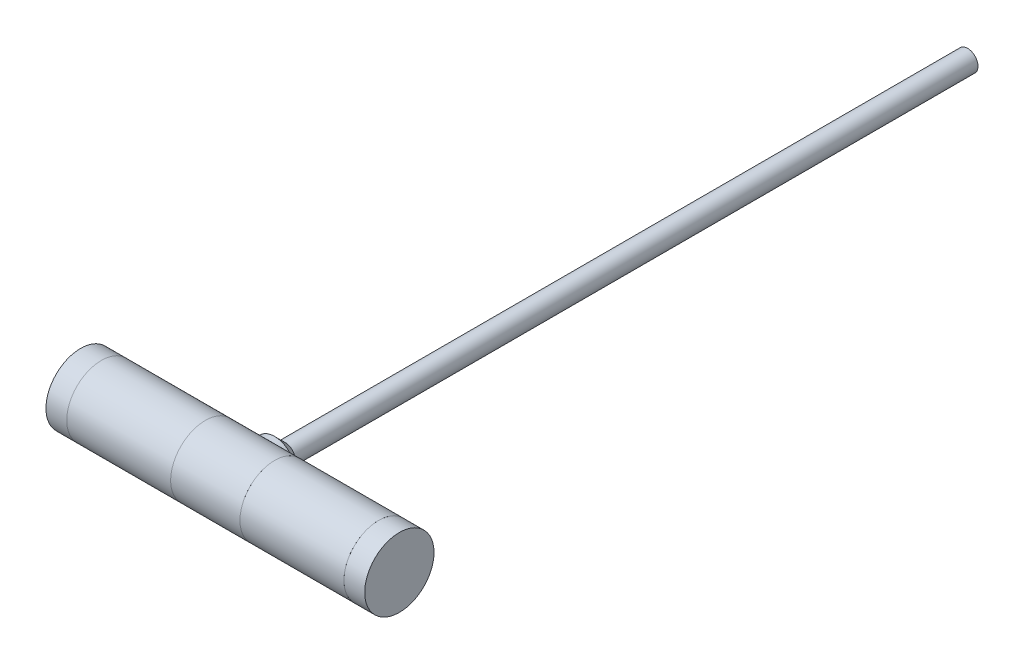
ISO-10303-21;
HEADER;
FILE_DESCRIPTION(('STEP AP214'),'2;1');
FILE_NAME('part.step','',(''),(''),'','','');
FILE_SCHEMA(('AUTOMOTIVE_DESIGN { 1 0 10303 214 1 1 1 1 }'));
ENDSEC;
DATA;
#1=APPLICATION_CONTEXT('core data for automotive mechanical design processes');
#2=APPLICATION_PROTOCOL_DEFINITION('international standard','automotive_design',2000,#1);
#3=PRODUCT_CONTEXT('',#1,'mechanical');
#4=PRODUCT('Part','Part','',(#3));
#5=PRODUCT_RELATED_PRODUCT_CATEGORY('part','',(#4));
#6=PRODUCT_DEFINITION_FORMATION('','',#4);
#7=PRODUCT_DEFINITION_CONTEXT('part definition',#1,'design');
#8=PRODUCT_DEFINITION('design','',#6,#7);
#9=PRODUCT_DEFINITION_SHAPE('','',#8);
#10=(LENGTH_UNIT() NAMED_UNIT(*) SI_UNIT(.MILLI.,.METRE.));
#11=(NAMED_UNIT(*) PLANE_ANGLE_UNIT() SI_UNIT($,.RADIAN.));
#12=(NAMED_UNIT(*) SI_UNIT($,.STERADIAN.) SOLID_ANGLE_UNIT());
#13=UNCERTAINTY_MEASURE_WITH_UNIT(LENGTH_MEASURE(1.E-05),#10,'distance_accuracy_value','');
#14=(GEOMETRIC_REPRESENTATION_CONTEXT(3) GLOBAL_UNCERTAINTY_ASSIGNED_CONTEXT((#13)) GLOBAL_UNIT_ASSIGNED_CONTEXT((#10,
#11,#12)) REPRESENTATION_CONTEXT('',''));
#15=CARTESIAN_POINT('',(0.,0.,0.));
#16=DIRECTION('',(0.,0.,1.));
#17=DIRECTION('',(1.,0.,0.));
#18=AXIS2_PLACEMENT_3D('',#15,#16,#17);
#19=CARTESIAN_POINT('',(-19.1421356237309,0.,0.));
#20=DIRECTION('',(1.,0.,0.));
#21=DIRECTION('',(0.,0.,-1.));
#22=AXIS2_PLACEMENT_3D('',#19,#20,#21);
#23=CYLINDRICAL_SURFACE('',#22,5.);
#24=CARTESIAN_POINT('',(3.,0.,-5.));
#25=CARTESIAN_POINT('',(2.99999894375546,-0.0767697294351705,-4.99999907546385));
#26=CARTESIAN_POINT('',(2.99704640642993,-0.153562134518387,-4.99822567812271));
#27=CARTESIAN_POINT('',(2.98528576702026,-0.306548487758715,-4.99118362570631));
#28=CARTESIAN_POINT('',(2.97647423881177,-0.382742059346593,-4.98591292553957));
#29=CARTESIAN_POINT('',(2.94135144053687,-0.609808130024627,-4.96499345352549));
#30=CARTESIAN_POINT('',(2.90635229756656,-0.758981863291667,-4.94423772571335));
#31=CARTESIAN_POINT('',(2.81522725649588,-1.04754167363585,-4.89123238995897));
#32=CARTESIAN_POINT('',(2.75920607798726,-1.18697226741342,-4.8590397955111));
#33=CARTESIAN_POINT('',(2.62827933940296,-1.45405042800218,-4.7859070225578));
#34=CARTESIAN_POINT('',(2.55337846763984,-1.58170090938261,-4.74496901614699));
#35=CARTESIAN_POINT('',(2.38045034488488,-1.83260160381823,-4.65410731283371));
#36=CARTESIAN_POINT('',(2.28109260883346,-1.95476885986166,-4.60373587041895));
#37=CARTESIAN_POINT('',(2.06506559280781,-2.1817645874806,-4.50060875905921));
#38=CARTESIAN_POINT('',(1.94837412578165,-2.28657046750403,-4.4478500955754));
#39=CARTESIAN_POINT('',(1.68415297883109,-2.48890019509837,-4.33822134833335));
#40=CARTESIAN_POINT('',(1.53459645787782,-2.5839553962784,-4.28164035635797));
#41=CARTESIAN_POINT('',(1.21830685367312,-2.74722868670786,-4.17876602596121));
#42=CARTESIAN_POINT('',(1.05160220796684,-2.8154903315581,-4.13245604474886));
#43=CARTESIAN_POINT('',(0.746807098343101,-2.90881204577224,-4.06709259377223));
#44=CARTESIAN_POINT('',(0.611528001638612,-2.94032394587637,-4.04415766338645));
#45=CARTESIAN_POINT('',(0.336392569478607,-2.98432344587083,-4.01180616527621));
#46=CARTESIAN_POINT('',(0.196542146695965,-2.99683469884359,-4.00237279089368));
#47=CARTESIAN_POINT('',(-0.0840229926478629,-3.0021101681982,-3.99841845126251));
#48=CARTESIAN_POINT('',(-0.224738865911874,-2.99483563630785,-4.00392674756739));
#49=CARTESIAN_POINT('',(-0.50255753511786,-2.96092124146105,-4.02906522155629));
#50=CARTESIAN_POINT('',(-0.639657532941489,-2.93426681225441,-4.04870602134773));
#51=CARTESIAN_POINT('',(-0.905060542250539,-2.86347831933193,-4.09906376582929));
#52=CARTESIAN_POINT('',(-1.03345432299445,-2.8195745342289,-4.12963433300037));
#53=CARTESIAN_POINT('',(-1.2813897666318,-2.71590167467071,-4.19854092703026));
#54=CARTESIAN_POINT('',(-1.40092816382903,-2.65612678414159,-4.2368797994146));
#55=CARTESIAN_POINT('',(-1.64996913765634,-2.5103577382067,-4.32510698365561));
#56=CARTESIAN_POINT('',(-1.77755999236773,-2.42160671901867,-4.3758426358075));
#57=CARTESIAN_POINT('',(-2.01734915722012,-2.22582963207776,-4.4786102252415));
#58=CARTESIAN_POINT('',(-2.12953256540213,-2.11878609335504,-4.53064336077653));
#59=CARTESIAN_POINT('',(-2.35124225944849,-1.87159040921357,-4.63871766962913));
#60=CARTESIAN_POINT('',(-2.45821939123735,-1.72890315178768,-4.69430681953073));
#61=CARTESIAN_POINT('',(-2.59926871272286,-1.50061053630278,-4.77018325995047));
#62=CARTESIAN_POINT('',(-2.64306413551611,-1.42209821815681,-4.79423315237467));
#63=CARTESIAN_POINT('',(-2.723718823611,-1.26074368673913,-4.83916496756429));
#64=CARTESIAN_POINT('',(-2.76058235202081,-1.17790417501175,-4.86004883588963));
#65=CARTESIAN_POINT('',(-2.82481144285664,-1.01376371174,-4.8968267274493));
#66=CARTESIAN_POINT('',(-2.85262656044921,-0.932690066663954,-4.91295100454953));
#67=CARTESIAN_POINT('',(-2.90133395584523,-0.767879949732823,-4.94139126794745));
#68=CARTESIAN_POINT('',(-2.92223010844636,-0.684144997174634,-4.95370938553284));
#69=CARTESIAN_POINT('',(-2.95677185472476,-0.51474446265442,-4.97416370514887));
#70=CARTESIAN_POINT('',(-2.97042275582861,-0.429080341969606,-4.98230296820872));
#71=CARTESIAN_POINT('',(-2.99026618439021,-0.256621746592203,-4.99415996414414));
#72=CARTESIAN_POINT('',(-2.99645976085132,-0.169827432617756,-4.99787831889699));
#73=CARTESIAN_POINT('',(-3.00299267028363,0.0673242571106461,-5.00179157954795));
#74=CARTESIAN_POINT('',(-2.9958115456306,0.218056842610665,-4.99746512571837));
#75=CARTESIAN_POINT('',(-2.9591544582709,0.515686907629,-4.97557955020067));
#76=CARTESIAN_POINT('',(-2.92967894765814,0.662584464852969,-4.95802069684413));
#77=CARTESIAN_POINT('',(-2.85091154081572,0.945142599254816,-4.91189447655688));
#78=CARTESIAN_POINT('',(-2.80211887340799,1.08098954856944,-4.88360514429733));
#79=CARTESIAN_POINT('',(-2.68664567579909,1.34253345184752,-4.81827798628348));
#80=CARTESIAN_POINT('',(-2.61996161740593,1.46822839746276,-4.78123843515362));
#81=CARTESIAN_POINT('',(-2.46288590902203,1.7200119213015,-4.69690981059277));
#82=CARTESIAN_POINT('',(-2.37075230616252,1.84478813824221,-4.6489560240695));
#83=CARTESIAN_POINT('',(-2.16921724874524,2.07805222548222,-4.54948534225871));
#84=CARTESIAN_POINT('',(-2.05979570039729,2.18652085154156,-4.49796434043363));
#85=CARTESIAN_POINT('',(-1.81017920850684,2.39863988264158,-4.38890846835682));
#86=CARTESIAN_POINT('',(-1.66783222605696,2.49982037884172,-4.33146483230154));
#87=CARTESIAN_POINT('',(-1.36556795387244,2.67690479207535,-4.22432364395571));
#88=CARTESIAN_POINT('',(-1.20566941284875,2.75283533845462,-4.1746179606141));
#89=CARTESIAN_POINT('',(-0.907513954889276,2.86285157351706,-4.09969818429266));
#90=CARTESIAN_POINT('',(-0.772039375357956,2.90243250662613,-4.07151318633887));
#91=CARTESIAN_POINT('',(-0.494935843764766,2.96227327821697,-4.02819211510624));
#92=CARTESIAN_POINT('',(-0.353315710548481,2.98255990395067,-4.01303795327895));
#93=CARTESIAN_POINT('',(-0.0672461056047843,3.00268261034206,-3.99800893189922));
#94=CARTESIAN_POINT('',(0.0772119782483016,3.00244179030845,-3.99819152744816));
#95=CARTESIAN_POINT('',(0.363788874346399,2.98132945103105,-4.01395435932838));
#96=CARTESIAN_POINT('',(0.505906371874806,2.96044671369591,-4.02954296823692));
#97=CARTESIAN_POINT('',(0.776976823995101,2.90080351212233,-4.07266369966216));
#98=CARTESIAN_POINT('',(0.906234147924359,2.86295284328648,-4.09958421715569));
#99=CARTESIAN_POINT('',(1.15667454965315,2.77126473512031,-4.16211005816609));
#100=CARTESIAN_POINT('',(1.27785456561299,2.7174212751772,-4.19771865147484));
#101=CARTESIAN_POINT('',(1.52863953945999,2.58578536859698,-4.28025972950371));
#102=CARTESIAN_POINT('',(1.65668150821477,2.50558518231556,-4.32809142579694));
#103=CARTESIAN_POINT('',(1.8987608453066,2.32751213746957,-4.42640286674054));
#104=CARTESIAN_POINT('',(2.01278655047955,2.22962472612067,-4.47688476749087));
#105=CARTESIAN_POINT('',(2.24269884332947,2.00020353552556,-4.5845123827036));
#106=CARTESIAN_POINT('',(2.35584987986161,1.86578571790514,-4.64140045738634));
#107=CARTESIAN_POINT('',(2.55820798604814,1.57689277813436,-4.74731429537958));
#108=CARTESIAN_POINT('',(2.64740647291971,1.42241049573676,-4.79633723789531));
#109=CARTESIAN_POINT('',(2.75912447419053,1.18102189661686,-4.85920558314903));
#110=CARTESIAN_POINT('',(2.79233599596449,1.10025014285136,-4.87817139185349));
#111=CARTESIAN_POINT('',(2.85177213814346,0.935442217988389,-4.91243413775203));
#112=CARTESIAN_POINT('',(2.87800083570093,0.851407984788103,-4.9277332153652));
#113=CARTESIAN_POINT('',(2.92300944207575,0.681001816074568,-4.95415527987996));
#114=CARTESIAN_POINT('',(2.9418110773033,0.594637500609295,-4.9652904423195));
#115=CARTESIAN_POINT('',(2.97174435532299,0.420183746020764,-4.98308318645253));
#116=CARTESIAN_POINT('',(2.98288238615331,0.332095806784397,-4.98974449723791));
#117=CARTESIAN_POINT('',(2.99339168380533,0.203123929661336,-4.99603728421477));
#118=CARTESIAN_POINT('',(2.995868430454,0.162556281113487,-4.99752198179196));
#119=CARTESIAN_POINT('',(2.99917289691394,0.081327878186766,-4.99950360169341));
#120=CARTESIAN_POINT('',(3.00000055952293,0.0406671206271709,-5.00000048975323));
#121=CARTESIAN_POINT('',(3.,0.,-5.));
#122=B_SPLINE_CURVE_WITH_KNOTS('',3,(#24,#25,#26,#27,#28,#29,#30,#31,#32,#33,#34,#35,#36,#37,
#38,#39,#40,#41,#42,#43,#44,#45,#46,#47,#48,#49,#50,#51,#52,#53,#54,#55,#56,#57,#58,#59,#60,#61,
#62,#63,#64,#65,#66,#67,#68,#69,#70,#71,#72,#73,#74,#75,#76,#77,#78,#79,#80,#81,#82,#83,#84,#85,
#86,#87,#88,#89,#90,#91,#92,#93,#94,#95,#96,#97,#98,#99,#100,#101,#102,#103,#104,#105,#106,#107,
#108,#109,#110,#111,#112,#113,#114,#115,#116,#117,#118,#119,#120,#121),.UNSPECIFIED.,.T.,.F.,(4,
2,2,2,2,2,2,2,2,2,2,2,2,2,2,2,2,2,2,2,2,2,2,2,2,2,2,2,2,2,2,2,2,2,2,2,2,2,2,2,2,2,2,2,2,2,2,2,
4),(0.,0.230263300595003,0.4606613693334,0.922002149276126,1.38107466343613,1.84003329022065,
2.33408870888555,2.82878205293211,3.38413315803225,3.93857770807793,4.35913349134877,
4.77916531256766,5.20002031165062,5.62119195971355,6.03692224610024,6.45280509043347,
6.94139679873935,7.43045779030959,7.98767605192993,8.26653157143431,8.54521503013734,
8.80648473589064,9.06760787545943,9.32853946730961,9.58943435026958,10.0398406663534,
10.490237849174,10.9296843257003,11.3692175250854,11.8543559282721,12.3400624135416,
12.8890638604651,13.437484464234,13.8674843581987,14.2968863865712,14.7278971274535,
15.1591422350194,15.5696105785277,15.9802336423656,16.4539008129506,16.927959499309,
17.4794148474152,18.0310675325446,18.2988384573895,18.5664526907294,18.8332781687618,
19.0998809626714,19.221853785686,19.3438308395353),.UNSPECIFIED.);
#123=CARTESIAN_POINT('',(3.,0.,-5.));
#124=VERTEX_POINT('',#123);
#125=CARTESIAN_POINT('',(-3.,0.,-5.));
#126=VERTEX_POINT('',#125);
#127=EDGE_CURVE('E56',#124,#126,#122,.T.);
#128=ORIENTED_EDGE('',*,*,#127,.F.);
#129=EDGE_CURVE('E69',#126,#124,#122,.T.);
#130=ORIENTED_EDGE('',*,*,#129,.F.);
#131=EDGE_LOOP('',(#128,#130));
#132=FACE_BOUND('',#131,.T.);
#133=CARTESIAN_POINT('',(-5.,0.,0.));
#134=DIRECTION('',(1.,0.,0.));
#135=DIRECTION('',(0.,0.,-1.));
#136=AXIS2_PLACEMENT_3D('',#133,#134,#135);
#137=CIRCLE('',#136,5.);
#138=CARTESIAN_POINT('',(-5.,0.,-5.));
#139=VERTEX_POINT('',#138);
#140=EDGE_CURVE('E75',#139,#139,#137,.F.);
#141=ORIENTED_EDGE('',*,*,#140,.F.);
#142=EDGE_LOOP('',(#141));
#143=FACE_BOUND('',#142,.T.);
#144=CARTESIAN_POINT('',(5.,0.,0.));
#145=DIRECTION('',(1.,0.,0.));
#146=DIRECTION('',(0.,0.,-1.));
#147=AXIS2_PLACEMENT_3D('',#144,#145,#146);
#148=CIRCLE('',#147,5.);
#149=CARTESIAN_POINT('',(5.,0.,-5.));
#150=VERTEX_POINT('',#149);
#151=EDGE_CURVE('E80',#150,#150,#148,.T.);
#152=ORIENTED_EDGE('',*,*,#151,.F.);
#153=EDGE_LOOP('',(#152));
#154=FACE_BOUND('',#153,.T.);
#155=ADVANCED_FACE('F48',(#132,#143,#154),#23,.T.);
#156=CARTESIAN_POINT('',(5.,0.,0.));
#157=DIRECTION('',(1.,0.,0.));
#158=DIRECTION('',(0.,0.,-1.));
#159=AXIS2_PLACEMENT_3D('',#156,#157,#158);
#160=PLANE('',#159);
#161=ORIENTED_EDGE('',*,*,#151,.T.);
#162=EDGE_LOOP('',(#161));
#163=FACE_BOUND('',#162,.T.);
#164=ADVANCED_FACE('F100',(#163),#160,.T.);
#165=CARTESIAN_POINT('',(-5.,0.,0.));
#166=DIRECTION('',(1.,0.,0.));
#167=DIRECTION('',(0.,0.,-1.));
#168=AXIS2_PLACEMENT_3D('',#165,#166,#167);
#169=PLANE('',#168);
#170=ORIENTED_EDGE('',*,*,#140,.T.);
#171=EDGE_LOOP('',(#170));
#172=FACE_BOUND('',#171,.T.);
#173=ADVANCED_FACE('F98',(#172),#169,.F.);
#174=CARTESIAN_POINT('',(0.,0.,-5.));
#175=DIRECTION('',(0.,0.,1.));
#176=DIRECTION('',(1.,0.,0.));
#177=AXIS2_PLACEMENT_3D('',#174,#175,#176);
#178=CYLINDRICAL_SURFACE('',#177,3.);
#179=CARTESIAN_POINT('',(0.,0.,-5.));
#180=DIRECTION('',(0.,0.,1.));
#181=DIRECTION('',(1.,0.,0.));
#182=AXIS2_PLACEMENT_3D('',#179,#180,#181);
#183=CIRCLE('',#182,3.);
#184=EDGE_CURVE('E62',#126,#124,#183,.T.);
#185=ORIENTED_EDGE('',*,*,#184,.T.);
#186=ORIENTED_EDGE('',*,*,#127,.T.);
#187=EDGE_LOOP('',(#185,#186));
#188=FACE_BOUND('',#187,.T.);
#189=ADVANCED_FACE('F76',(#188),#178,.T.);
#190=EDGE_CURVE('E74',#124,#126,#183,.T.);
#191=ORIENTED_EDGE('',*,*,#190,.T.);
#192=ORIENTED_EDGE('',*,*,#129,.T.);
#193=EDGE_LOOP('',(#191,#192));
#194=FACE_BOUND('',#193,.T.);
#195=ADVANCED_FACE('F73',(#194),#178,.T.);
#196=CARTESIAN_POINT('',(0.,0.,-105.));
#197=DIRECTION('',(0.,0.,1.));
#198=DIRECTION('',(1.,0.,0.));
#199=AXIS2_PLACEMENT_3D('',#196,#197,#198);
#200=CYLINDRICAL_SURFACE('',#199,1.5);
#201=CARTESIAN_POINT('',(0.,0.,-6.50000000000001));
#202=DIRECTION('',(0.,0.,1.));
#203=DIRECTION('',(1.,0.,0.));
#204=AXIS2_PLACEMENT_3D('',#201,#202,#203);
#205=CIRCLE('',#204,1.5);
#206=CARTESIAN_POINT('',(1.5,0.,-6.50000000000001));
#207=VERTEX_POINT('',#206);
#208=EDGE_CURVE('E12',#207,#207,#205,.F.);
#209=ORIENTED_EDGE('',*,*,#208,.T.);
#210=EDGE_LOOP('',(#209));
#211=FACE_BOUND('',#210,.T.);
#212=CARTESIAN_POINT('',(0.,0.,-105.));
#213=DIRECTION('',(0.,0.,-1.));
#214=DIRECTION('',(-1.,0.,0.));
#215=AXIS2_PLACEMENT_3D('',#212,#213,#214);
#216=CIRCLE('',#215,1.5);
#217=CARTESIAN_POINT('',(-1.5,0.,-105.));
#218=VERTEX_POINT('',#217);
#219=EDGE_CURVE('E77',#218,#218,#216,.T.);
#220=ORIENTED_EDGE('',*,*,#219,.F.);
#221=EDGE_LOOP('',(#220));
#222=FACE_BOUND('',#221,.T.);
#223=ADVANCED_FACE('F96',(#211,#222),#200,.T.);
#224=CARTESIAN_POINT('',(0.,0.,-105.));
#225=DIRECTION('',(0.,0.,-1.));
#226=DIRECTION('',(-1.,0.,0.));
#227=AXIS2_PLACEMENT_3D('',#224,#225,#226);
#228=PLANE('',#227);
#229=ORIENTED_EDGE('',*,*,#219,.T.);
#230=EDGE_LOOP('',(#229));
#231=FACE_BOUND('',#230,.T.);
#232=ADVANCED_FACE('F118',(#231),#228,.T.);
#233=CARTESIAN_POINT('',(0.,0.,-6.50000000000001));
#234=DIRECTION('',(0.,0.,1.));
#235=DIRECTION('',(1.,0.,0.));
#236=AXIS2_PLACEMENT_3D('',#233,#234,#235);
#237=CONICAL_SURFACE('',#236,1.5,0.785398163397449);
#238=ORIENTED_EDGE('',*,*,#184,.F.);
#239=ORIENTED_EDGE('',*,*,#190,.F.);
#240=EDGE_LOOP('',(#238,#239));
#241=FACE_BOUND('',#240,.T.);
#242=ORIENTED_EDGE('',*,*,#208,.F.);
#243=EDGE_LOOP('',(#242));
#244=FACE_BOUND('',#243,.T.);
#245=ADVANCED_FACE('F50',(#241,#244),#237,.T.);
#246=CLOSED_SHELL('',(#155,#164,#173,#189,#195,#223,#232,#245));
#247=MANIFOLD_SOLID_BREP('B2',#246);
#248=CARTESIAN_POINT('',(-34.1421356237309,0.,0.));
#249=DIRECTION('',(1.,0.,0.));
#250=DIRECTION('',(0.,0.,-1.));
#251=AXIS2_PLACEMENT_3D('',#248,#249,#250);
#252=CYLINDRICAL_SURFACE('',#251,5.);
#253=CARTESIAN_POINT('',(-20.,0.,0.));
#254=DIRECTION('',(1.,0.,0.));
#255=DIRECTION('',(0.,0.,-1.));
#256=AXIS2_PLACEMENT_3D('',#253,#254,#255);
#257=CIRCLE('',#256,5.);
#258=CARTESIAN_POINT('',(-20.,0.,-5.));
#259=VERTEX_POINT('',#258);
#260=EDGE_CURVE('E47',#259,#259,#257,.F.);
#261=CARTESIAN_POINT('',(-5.,0.,0.));
#262=DIRECTION('',(1.,0.,0.));
#263=DIRECTION('',(0.,0.,-1.));
#264=AXIS2_PLACEMENT_3D('',#261,#262,#263);
#265=CIRCLE('',#264,5.);
#266=CARTESIAN_POINT('',(-5.,0.,-5.));
#267=VERTEX_POINT('',#266);
#268=EDGE_CURVE('E183',#267,#267,#265,.T.);
#269=CARTESIAN_POINT('',(-20.,0.,-5.));
#270=CARTESIAN_POINT('',(-19.84375,0.,-5.));
#271=CARTESIAN_POINT('',(-19.6875,0.,-5.));
#272=CARTESIAN_POINT('',(-19.375,0.,-5.));
#273=CARTESIAN_POINT('',(-19.21875,0.,-5.));
#274=CARTESIAN_POINT('',(-18.90625,0.,-5.));
#275=CARTESIAN_POINT('',(-18.75,0.,-5.));
#276=CARTESIAN_POINT('',(-18.4375,0.,-5.));
#277=CARTESIAN_POINT('',(-18.28125,0.,-5.));
#278=CARTESIAN_POINT('',(-17.96875,0.,-5.));
#279=CARTESIAN_POINT('',(-17.8125,0.,-5.));
#280=CARTESIAN_POINT('',(-17.5,0.,-5.));
#281=CARTESIAN_POINT('',(-17.34375,0.,-5.));
#282=CARTESIAN_POINT('',(-17.03125,0.,-5.));
#283=CARTESIAN_POINT('',(-16.875,0.,-5.));
#284=CARTESIAN_POINT('',(-16.5625,0.,-5.));
#285=CARTESIAN_POINT('',(-16.40625,0.,-5.));
#286=CARTESIAN_POINT('',(-16.09375,0.,-5.));
#287=CARTESIAN_POINT('',(-15.9375,0.,-5.));
#288=CARTESIAN_POINT('',(-15.625,0.,-5.));
#289=CARTESIAN_POINT('',(-15.46875,0.,-5.));
#290=CARTESIAN_POINT('',(-15.15625,0.,-5.));
#291=CARTESIAN_POINT('',(-15.,0.,-5.));
#292=CARTESIAN_POINT('',(-14.6875,0.,-5.));
#293=CARTESIAN_POINT('',(-14.53125,0.,-5.));
#294=CARTESIAN_POINT('',(-14.21875,0.,-5.));
#295=CARTESIAN_POINT('',(-14.0625,0.,-5.));
#296=CARTESIAN_POINT('',(-13.75,0.,-5.));
#297=CARTESIAN_POINT('',(-13.59375,0.,-5.));
#298=CARTESIAN_POINT('',(-13.28125,0.,-5.));
#299=CARTESIAN_POINT('',(-13.125,0.,-5.));
#300=CARTESIAN_POINT('',(-12.8125,0.,-5.));
#301=CARTESIAN_POINT('',(-12.65625,0.,-5.));
#302=CARTESIAN_POINT('',(-12.34375,0.,-5.));
#303=CARTESIAN_POINT('',(-12.1875,0.,-5.));
#304=CARTESIAN_POINT('',(-11.875,0.,-5.));
#305=CARTESIAN_POINT('',(-11.71875,0.,-5.));
#306=CARTESIAN_POINT('',(-11.40625,0.,-5.));
#307=CARTESIAN_POINT('',(-11.25,0.,-5.));
#308=CARTESIAN_POINT('',(-10.9375,0.,-5.));
#309=CARTESIAN_POINT('',(-10.78125,0.,-5.));
#310=CARTESIAN_POINT('',(-10.46875,0.,-5.));
#311=CARTESIAN_POINT('',(-10.3125,0.,-5.));
#312=CARTESIAN_POINT('',(-10.,0.,-5.));
#313=CARTESIAN_POINT('',(-9.84375,0.,-5.));
#314=CARTESIAN_POINT('',(-9.53125,0.,-5.));
#315=CARTESIAN_POINT('',(-9.375,0.,-5.));
#316=CARTESIAN_POINT('',(-9.0625,0.,-5.));
#317=CARTESIAN_POINT('',(-8.90625,0.,-5.));
#318=CARTESIAN_POINT('',(-8.59375,0.,-5.));
#319=CARTESIAN_POINT('',(-8.4375,0.,-5.));
#320=CARTESIAN_POINT('',(-8.125,0.,-5.));
#321=CARTESIAN_POINT('',(-7.96875,0.,-5.));
#322=CARTESIAN_POINT('',(-7.65625,0.,-5.));
#323=CARTESIAN_POINT('',(-7.5,0.,-5.));
#324=CARTESIAN_POINT('',(-7.1875,0.,-5.));
#325=CARTESIAN_POINT('',(-7.03125,0.,-5.));
#326=CARTESIAN_POINT('',(-6.71875,0.,-5.));
#327=CARTESIAN_POINT('',(-6.5625,0.,-5.));
#328=CARTESIAN_POINT('',(-6.25,0.,-5.));
#329=CARTESIAN_POINT('',(-6.09375,0.,-5.));
#330=CARTESIAN_POINT('',(-5.78125,0.,-5.));
#331=CARTESIAN_POINT('',(-5.625,0.,-5.));
#332=CARTESIAN_POINT('',(-5.3125,0.,-5.));
#333=CARTESIAN_POINT('',(-5.15625,0.,-5.));
#334=CARTESIAN_POINT('',(-5.,0.,-5.));
#335=B_SPLINE_CURVE_WITH_KNOTS('',3,(#269,#270,#271,#272,#273,#274,#275,#276,#277,#278,#279,
#280,#281,#282,#283,#284,#285,#286,#287,#288,#289,#290,#291,#292,#293,#294,#295,#296,#297,#298,
#299,#300,#301,#302,#303,#304,#305,#306,#307,#308,#309,#310,#311,#312,#313,#314,#315,#316,#317,
#318,#319,#320,#321,#322,#323,#324,#325,#326,#327,#328,#329,#330,#331,#332,#333,#334),
.UNSPECIFIED.,.F.,.F.,(4,2,2,2,2,2,2,2,2,2,2,2,2,2,2,2,2,2,2,2,2,2,2,2,2,2,2,2,2,2,2,2,4),(0.,
0.468750000000004,0.937500000000001,1.40625,1.875,2.34375,2.8125,3.28125,3.75,4.21875,4.6875,
5.15625,5.625,6.09375,6.5625,7.03125,7.5,7.96875,8.4375,8.90625,9.375,9.84375,10.3125,10.78125,
11.25,11.71875,12.1875,12.65625,13.125,13.59375,14.0625,14.53125,15.),.UNSPECIFIED.);
#336=EDGE_CURVE('BSEAM177',#259,#267,#335,.T.);
#337=ORIENTED_EDGE('',*,*,#260,.F.);
#338=ORIENTED_EDGE('',*,*,#268,.F.);
#339=ORIENTED_EDGE('',*,*,#336,.T.);
#340=ORIENTED_EDGE('',*,*,#336,.F.);
#341=EDGE_LOOP('',(#337,#339,#338,#340));
#342=FACE_BOUND('',#341,.T.);
#343=ADVANCED_FACE('F177',(#342),#252,.T.);
#344=CARTESIAN_POINT('',(-5.,0.,0.));
#345=DIRECTION('',(1.,0.,0.));
#346=DIRECTION('',(0.,0.,-1.));
#347=AXIS2_PLACEMENT_3D('',#344,#345,#346);
#348=PLANE('',#347);
#349=ORIENTED_EDGE('',*,*,#268,.T.);
#350=EDGE_LOOP('',(#349));
#351=FACE_BOUND('',#350,.T.);
#352=ADVANCED_FACE('F189',(#351),#348,.T.);
#353=CARTESIAN_POINT('',(-20.,0.,0.));
#354=DIRECTION('',(1.,0.,0.));
#355=DIRECTION('',(0.,0.,-1.));
#356=AXIS2_PLACEMENT_3D('',#353,#354,#355);
#357=PLANE('',#356);
#358=ORIENTED_EDGE('',*,*,#260,.T.);
#359=EDGE_LOOP('',(#358));
#360=FACE_BOUND('',#359,.T.);
#361=ADVANCED_FACE('F196',(#360),#357,.F.);
#362=CLOSED_SHELL('',(#343,#352,#361));
#363=MANIFOLD_SOLID_BREP('B6',#362);
#364=CARTESIAN_POINT('',(34.1421356237309,0.,0.));
#365=DIRECTION('',(-1.,0.,0.));
#366=DIRECTION('',(0.,0.,1.));
#367=AXIS2_PLACEMENT_3D('',#364,#365,#366);
#368=CYLINDRICAL_SURFACE('',#367,5.);
#369=CARTESIAN_POINT('',(5.,0.,0.));
#370=DIRECTION('',(1.,0.,0.));
#371=DIRECTION('',(0.,0.,-1.));
#372=AXIS2_PLACEMENT_3D('',#369,#370,#371);
#373=CIRCLE('',#372,5.);
#374=CARTESIAN_POINT('',(5.,0.,5.));
#375=VERTEX_POINT('',#374);
#376=EDGE_CURVE('E232',#375,#375,#373,.T.);
#377=CARTESIAN_POINT('',(20.,0.,0.));
#378=DIRECTION('',(1.,0.,0.));
#379=DIRECTION('',(0.,0.,-1.));
#380=AXIS2_PLACEMENT_3D('',#377,#378,#379);
#381=CIRCLE('',#380,5.);
#382=CARTESIAN_POINT('',(20.,0.,5.));
#383=VERTEX_POINT('',#382);
#384=EDGE_CURVE('E176',#383,#383,#381,.T.);
#385=CARTESIAN_POINT('',(5.,0.,5.));
#386=CARTESIAN_POINT('',(5.15625,0.,5.));
#387=CARTESIAN_POINT('',(5.3125,0.,5.));
#388=CARTESIAN_POINT('',(5.625,0.,5.));
#389=CARTESIAN_POINT('',(5.78125,0.,5.));
#390=CARTESIAN_POINT('',(6.09375,0.,5.));
#391=CARTESIAN_POINT('',(6.25,0.,5.));
#392=CARTESIAN_POINT('',(6.5625,0.,5.));
#393=CARTESIAN_POINT('',(6.71875,0.,5.));
#394=CARTESIAN_POINT('',(7.03125,0.,5.));
#395=CARTESIAN_POINT('',(7.1875,0.,5.));
#396=CARTESIAN_POINT('',(7.5,0.,5.));
#397=CARTESIAN_POINT('',(7.65625,0.,5.));
#398=CARTESIAN_POINT('',(7.96875,0.,5.));
#399=CARTESIAN_POINT('',(8.125,0.,5.));
#400=CARTESIAN_POINT('',(8.4375,0.,5.));
#401=CARTESIAN_POINT('',(8.59375,0.,5.));
#402=CARTESIAN_POINT('',(8.90625,0.,5.));
#403=CARTESIAN_POINT('',(9.0625,0.,5.));
#404=CARTESIAN_POINT('',(9.375,0.,5.));
#405=CARTESIAN_POINT('',(9.53125,0.,5.));
#406=CARTESIAN_POINT('',(9.84375,0.,5.));
#407=CARTESIAN_POINT('',(10.,0.,5.));
#408=CARTESIAN_POINT('',(10.3125,0.,5.));
#409=CARTESIAN_POINT('',(10.46875,0.,5.));
#410=CARTESIAN_POINT('',(10.78125,0.,5.));
#411=CARTESIAN_POINT('',(10.9375,0.,5.));
#412=CARTESIAN_POINT('',(11.25,0.,5.));
#413=CARTESIAN_POINT('',(11.40625,0.,5.));
#414=CARTESIAN_POINT('',(11.71875,0.,5.));
#415=CARTESIAN_POINT('',(11.875,0.,5.));
#416=CARTESIAN_POINT('',(12.1875,0.,5.));
#417=CARTESIAN_POINT('',(12.34375,0.,5.));
#418=CARTESIAN_POINT('',(12.65625,0.,5.));
#419=CARTESIAN_POINT('',(12.8125,0.,5.));
#420=CARTESIAN_POINT('',(13.125,0.,5.));
#421=CARTESIAN_POINT('',(13.28125,0.,5.));
#422=CARTESIAN_POINT('',(13.59375,0.,5.));
#423=CARTESIAN_POINT('',(13.75,0.,5.));
#424=CARTESIAN_POINT('',(14.0625,0.,5.));
#425=CARTESIAN_POINT('',(14.21875,0.,5.));
#426=CARTESIAN_POINT('',(14.53125,0.,5.));
#427=CARTESIAN_POINT('',(14.6875,0.,5.));
#428=CARTESIAN_POINT('',(15.,0.,5.));
#429=CARTESIAN_POINT('',(15.15625,0.,5.));
#430=CARTESIAN_POINT('',(15.46875,0.,5.));
#431=CARTESIAN_POINT('',(15.625,0.,5.));
#432=CARTESIAN_POINT('',(15.9375,0.,5.));
#433=CARTESIAN_POINT('',(16.09375,0.,5.));
#434=CARTESIAN_POINT('',(16.40625,0.,5.));
#435=CARTESIAN_POINT('',(16.5625,0.,5.));
#436=CARTESIAN_POINT('',(16.875,0.,5.));
#437=CARTESIAN_POINT('',(17.03125,0.,5.));
#438=CARTESIAN_POINT('',(17.34375,0.,5.));
#439=CARTESIAN_POINT('',(17.5,0.,5.));
#440=CARTESIAN_POINT('',(17.8125,0.,5.));
#441=CARTESIAN_POINT('',(17.96875,0.,5.));
#442=CARTESIAN_POINT('',(18.28125,0.,5.));
#443=CARTESIAN_POINT('',(18.4375,0.,5.));
#444=CARTESIAN_POINT('',(18.75,0.,5.));
#445=CARTESIAN_POINT('',(18.90625,0.,5.));
#446=CARTESIAN_POINT('',(19.21875,0.,5.));
#447=CARTESIAN_POINT('',(19.375,0.,5.));
#448=CARTESIAN_POINT('',(19.6875,0.,5.));
#449=CARTESIAN_POINT('',(19.84375,0.,5.));
#450=CARTESIAN_POINT('',(20.,0.,5.));
#451=B_SPLINE_CURVE_WITH_KNOTS('',3,(#385,#386,#387,#388,#389,#390,#391,#392,#393,#394,#395,
#396,#397,#398,#399,#400,#401,#402,#403,#404,#405,#406,#407,#408,#409,#410,#411,#412,#413,#414,
#415,#416,#417,#418,#419,#420,#421,#422,#423,#424,#425,#426,#427,#428,#429,#430,#431,#432,#433,
#434,#435,#436,#437,#438,#439,#440,#441,#442,#443,#444,#445,#446,#447,#448,#449,#450),
.UNSPECIFIED.,.F.,.F.,(4,2,2,2,2,2,2,2,2,2,2,2,2,2,2,2,2,2,2,2,2,2,2,2,2,2,2,2,2,2,2,2,4),(0.,
0.46875,0.937500000000001,1.40625,1.875,2.34375,2.8125,3.28125,3.75,4.21875,4.6875,5.15625,
5.625,6.09375,6.5625,7.03125,7.5,7.96875,8.4375,8.90625,9.375,9.84375,10.3125,10.78125,11.25,
11.71875,12.1875,12.65625,13.125,13.59375,14.0625,14.53125,15.),.UNSPECIFIED.);
#452=EDGE_CURVE('BSEAM225',#375,#383,#451,.T.);
#453=ORIENTED_EDGE('',*,*,#376,.T.);
#454=ORIENTED_EDGE('',*,*,#384,.F.);
#455=ORIENTED_EDGE('',*,*,#452,.T.);
#456=ORIENTED_EDGE('',*,*,#452,.F.);
#457=EDGE_LOOP('',(#453,#455,#454,#456));
#458=FACE_BOUND('',#457,.T.);
#459=ADVANCED_FACE('F225',(#458),#368,.T.);
#460=CARTESIAN_POINT('',(5.,0.,0.));
#461=DIRECTION('',(1.,0.,0.));
#462=DIRECTION('',(0.,0.,-1.));
#463=AXIS2_PLACEMENT_3D('',#460,#461,#462);
#464=PLANE('',#463);
#465=ORIENTED_EDGE('',*,*,#376,.F.);
#466=EDGE_LOOP('',(#465));
#467=FACE_BOUND('',#466,.T.);
#468=ADVANCED_FACE('F240',(#467),#464,.F.);
#469=CARTESIAN_POINT('',(20.,0.,0.));
#470=DIRECTION('',(1.,0.,0.));
#471=DIRECTION('',(0.,0.,-1.));
#472=AXIS2_PLACEMENT_3D('',#469,#470,#471);
#473=PLANE('',#472);
#474=ORIENTED_EDGE('',*,*,#384,.T.);
#475=EDGE_LOOP('',(#474));
#476=FACE_BOUND('',#475,.T.);
#477=ADVANCED_FACE('F227',(#476),#473,.T.);
#478=CLOSED_SHELL('',(#459,#468,#477));
#479=MANIFOLD_SOLID_BREP('B42',#478);
#480=CARTESIAN_POINT('',(-23.,0.,0.));
#481=DIRECTION('',(1.,0.,0.));
#482=DIRECTION('',(0.,0.,-1.));
#483=AXIS2_PLACEMENT_3D('',#480,#481,#482);
#484=CYLINDRICAL_SURFACE('',#483,5.);
#485=CARTESIAN_POINT('',(-23.,0.,0.));
#486=DIRECTION('',(1.,0.,0.));
#487=DIRECTION('',(0.,0.,-1.));
#488=AXIS2_PLACEMENT_3D('',#485,#486,#487);
#489=CIRCLE('',#488,5.);
#490=CARTESIAN_POINT('',(-23.,0.,-5.));
#491=VERTEX_POINT('',#490);
#492=EDGE_CURVE('E224',#491,#491,#489,.T.);
#493=ORIENTED_EDGE('',*,*,#492,.T.);
#494=EDGE_LOOP('',(#493));
#495=FACE_BOUND('',#494,.T.);
#496=CARTESIAN_POINT('',(-20.,0.,0.));
#497=DIRECTION('',(1.,0.,0.));
#498=DIRECTION('',(0.,0.,-1.));
#499=AXIS2_PLACEMENT_3D('',#496,#497,#498);
#500=CIRCLE('',#499,5.);
#501=CARTESIAN_POINT('',(-20.,0.,-5.));
#502=VERTEX_POINT('',#501);
#503=EDGE_CURVE('E275',#502,#502,#500,.T.);
#504=ORIENTED_EDGE('',*,*,#503,.F.);
#505=EDGE_LOOP('',(#504));
#506=FACE_BOUND('',#505,.T.);
#507=ADVANCED_FACE('F272',(#495,#506),#484,.T.);
#508=CARTESIAN_POINT('',(-23.,0.,0.));
#509=DIRECTION('',(1.,0.,0.));
#510=DIRECTION('',(0.,0.,-1.));
#511=AXIS2_PLACEMENT_3D('',#508,#509,#510);
#512=PLANE('',#511);
#513=ORIENTED_EDGE('',*,*,#492,.F.);
#514=EDGE_LOOP('',(#513));
#515=FACE_BOUND('',#514,.T.);
#516=ADVANCED_FACE('F287',(#515),#512,.F.);
#517=CARTESIAN_POINT('',(-20.,0.,0.));
#518=DIRECTION('',(1.,0.,0.));
#519=DIRECTION('',(0.,0.,-1.));
#520=AXIS2_PLACEMENT_3D('',#517,#518,#519);
#521=PLANE('',#520);
#522=ORIENTED_EDGE('',*,*,#503,.T.);
#523=EDGE_LOOP('',(#522));
#524=FACE_BOUND('',#523,.T.);
#525=ADVANCED_FACE('F284',(#524),#521,.T.);
#526=CLOSED_SHELL('',(#507,#516,#525));
#527=MANIFOLD_SOLID_BREP('B171',#526);
#528=CARTESIAN_POINT('',(23.,0.,0.));
#529=DIRECTION('',(-1.,0.,0.));
#530=DIRECTION('',(0.,0.,1.));
#531=AXIS2_PLACEMENT_3D('',#528,#529,#530);
#532=CYLINDRICAL_SURFACE('',#531,5.);
#533=CARTESIAN_POINT('',(23.,0.,0.));
#534=DIRECTION('',(1.,0.,0.));
#535=DIRECTION('',(0.,0.,-1.));
#536=AXIS2_PLACEMENT_3D('',#533,#534,#535);
#537=CIRCLE('',#536,5.);
#538=CARTESIAN_POINT('',(23.,0.,-5.));
#539=VERTEX_POINT('',#538);
#540=EDGE_CURVE('E271',#539,#539,#537,.T.);
#541=ORIENTED_EDGE('',*,*,#540,.F.);
#542=EDGE_LOOP('',(#541));
#543=FACE_BOUND('',#542,.T.);
#544=CARTESIAN_POINT('',(20.,0.,0.));
#545=DIRECTION('',(1.,0.,0.));
#546=DIRECTION('',(0.,0.,-1.));
#547=AXIS2_PLACEMENT_3D('',#544,#545,#546);
#548=CIRCLE('',#547,5.);
#549=CARTESIAN_POINT('',(20.,0.,-5.));
#550=VERTEX_POINT('',#549);
#551=EDGE_CURVE('E315',#550,#550,#548,.T.);
#552=ORIENTED_EDGE('',*,*,#551,.T.);
#553=EDGE_LOOP('',(#552));
#554=FACE_BOUND('',#553,.T.);
#555=ADVANCED_FACE('F312',(#543,#554),#532,.T.);
#556=CARTESIAN_POINT('',(23.,0.,0.));
#557=DIRECTION('',(1.,0.,0.));
#558=DIRECTION('',(0.,0.,-1.));
#559=AXIS2_PLACEMENT_3D('',#556,#557,#558);
#560=PLANE('',#559);
#561=ORIENTED_EDGE('',*,*,#540,.T.);
#562=EDGE_LOOP('',(#561));
#563=FACE_BOUND('',#562,.T.);
#564=ADVANCED_FACE('F327',(#563),#560,.T.);
#565=CARTESIAN_POINT('',(20.,0.,0.));
#566=DIRECTION('',(1.,0.,0.));
#567=DIRECTION('',(0.,0.,-1.));
#568=AXIS2_PLACEMENT_3D('',#565,#566,#567);
#569=PLANE('',#568);
#570=ORIENTED_EDGE('',*,*,#551,.F.);
#571=EDGE_LOOP('',(#570));
#572=FACE_BOUND('',#571,.T.);
#573=ADVANCED_FACE('F325',(#572),#569,.F.);
#574=CLOSED_SHELL('',(#555,#564,#573));
#575=MANIFOLD_SOLID_BREP('B219',#574);
#576=ADVANCED_BREP_SHAPE_REPRESENTATION('',(#18,#247,#363,#479,#527,#575),#14);
#577=SHAPE_DEFINITION_REPRESENTATION(#9,#576);
ENDSEC;
END-ISO-10303-21;
